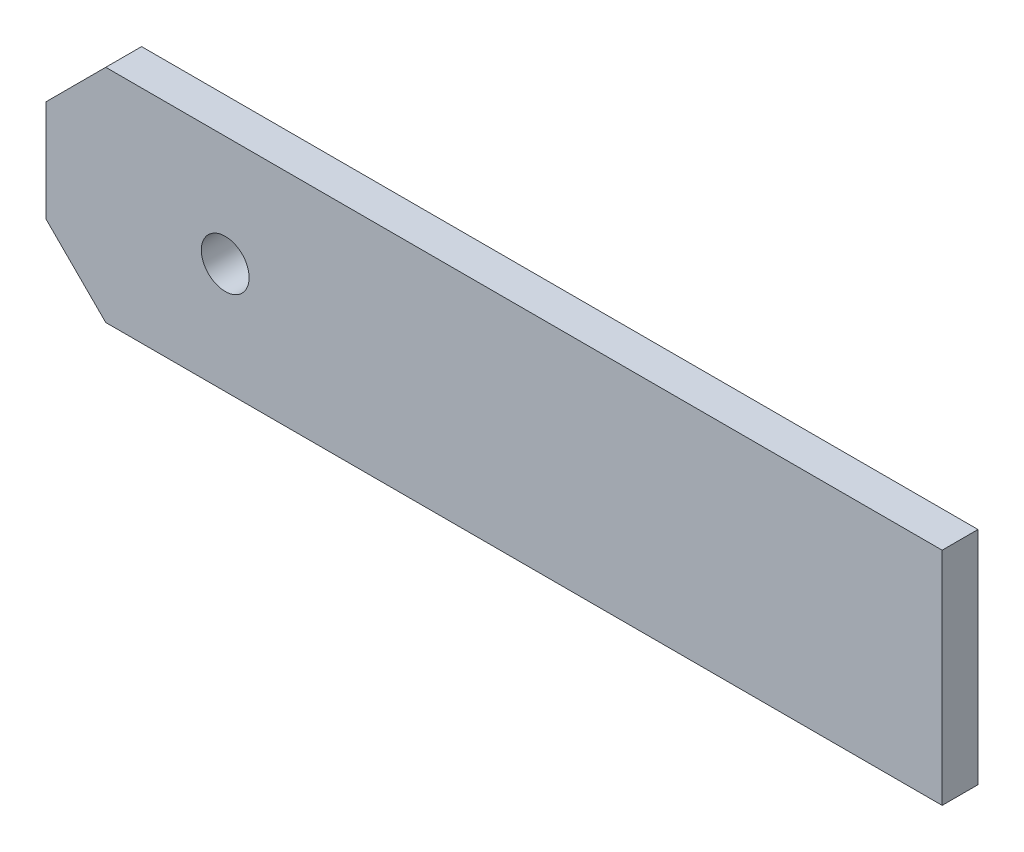
ISO-10303-21;
HEADER;
FILE_DESCRIPTION(('STEP AP214'),'2;1');
FILE_NAME('part.step','',(''),(''),'','','');
FILE_SCHEMA(('AUTOMOTIVE_DESIGN { 1 0 10303 214 1 1 1 1 }'));
ENDSEC;
DATA;
#1=APPLICATION_CONTEXT('core data for automotive mechanical design processes');
#2=APPLICATION_PROTOCOL_DEFINITION('international standard','automotive_design',2000,#1);
#3=PRODUCT_CONTEXT('',#1,'mechanical');
#4=PRODUCT('Part','Part','',(#3));
#5=PRODUCT_RELATED_PRODUCT_CATEGORY('part','',(#4));
#6=PRODUCT_DEFINITION_FORMATION('','',#4);
#7=PRODUCT_DEFINITION_CONTEXT('part definition',#1,'design');
#8=PRODUCT_DEFINITION('design','',#6,#7);
#9=PRODUCT_DEFINITION_SHAPE('','',#8);
#10=(LENGTH_UNIT() NAMED_UNIT(*) SI_UNIT(.MILLI.,.METRE.));
#11=(NAMED_UNIT(*) PLANE_ANGLE_UNIT() SI_UNIT($,.RADIAN.));
#12=(NAMED_UNIT(*) SI_UNIT($,.STERADIAN.) SOLID_ANGLE_UNIT());
#13=UNCERTAINTY_MEASURE_WITH_UNIT(LENGTH_MEASURE(1.E-05),#10,'distance_accuracy_value','');
#14=(GEOMETRIC_REPRESENTATION_CONTEXT(3) GLOBAL_UNCERTAINTY_ASSIGNED_CONTEXT((#13)) GLOBAL_UNIT_ASSIGNED_CONTEXT((#10,
#11,#12)) REPRESENTATION_CONTEXT('',''));
#15=CARTESIAN_POINT('',(0.,0.,0.));
#16=DIRECTION('',(0.,0.,1.));
#17=DIRECTION('',(1.,0.,0.));
#18=AXIS2_PLACEMENT_3D('',#15,#16,#17);
#19=CARTESIAN_POINT('',(0.,0.,6.));
#20=DIRECTION('',(0.,0.,-1.));
#21=DIRECTION('',(-1.,0.,0.));
#22=AXIS2_PLACEMENT_3D('',#19,#20,#21);
#23=PLANE('',#22);
#24=DIRECTION('',(-0.707106781186548,-0.707106781186547,0.));
#25=VECTOR('',#24,1.);
#26=CARTESIAN_POINT('',(-1007.41573033708,56.1348314606742,6.));
#27=LINE('',#26,#25);
#28=CARTESIAN_POINT('',(-997.415730337079,66.1348314606741,6.));
#29=VERTEX_POINT('',#28);
#30=CARTESIAN_POINT('',(-1007.41573033708,56.1348314606742,6.));
#31=VERTEX_POINT('',#30);
#32=EDGE_CURVE('E133',#29,#31,#27,.T.);
#33=ORIENTED_EDGE('',*,*,#32,.T.);
#34=DIRECTION('',(0.,-1.,0.));
#35=VECTOR('',#34,1.);
#36=CARTESIAN_POINT('',(-1007.41573033708,56.1348314606742,6.));
#37=LINE('',#36,#35);
#38=CARTESIAN_POINT('',(-1007.41573033708,39.1348314606742,6.));
#39=VERTEX_POINT('',#38);
#40=EDGE_CURVE('E91',#31,#39,#37,.T.);
#41=ORIENTED_EDGE('',*,*,#40,.T.);
#42=DIRECTION('',(0.707106781186548,-0.707106781186547,0.));
#43=VECTOR('',#42,1.);
#44=CARTESIAN_POINT('',(-1007.41573033708,39.1348314606742,6.));
#45=LINE('',#44,#43);
#46=CARTESIAN_POINT('',(-997.415730337079,29.1348314606742,6.));
#47=VERTEX_POINT('',#46);
#48=EDGE_CURVE('E104',#39,#47,#45,.T.);
#49=ORIENTED_EDGE('',*,*,#48,.T.);
#50=DIRECTION('',(1.,0.,0.));
#51=VECTOR('',#50,1.);
#52=CARTESIAN_POINT('',(-997.415730337079,29.1348314606742,6.));
#53=LINE('',#52,#51);
#54=CARTESIAN_POINT('',(-857.415730337079,29.1348314606742,6.));
#55=VERTEX_POINT('',#54);
#56=EDGE_CURVE('E98',#47,#55,#53,.T.);
#57=ORIENTED_EDGE('',*,*,#56,.T.);
#58=DIRECTION('',(0.,1.,0.));
#59=VECTOR('',#58,1.);
#60=CARTESIAN_POINT('',(-857.415730337079,66.1348314606741,6.));
#61=LINE('',#60,#59);
#62=CARTESIAN_POINT('',(-857.415730337079,66.1348314606741,6.));
#63=VERTEX_POINT('',#62);
#64=EDGE_CURVE('E102',#55,#63,#61,.T.);
#65=ORIENTED_EDGE('',*,*,#64,.T.);
#66=DIRECTION('',(-1.,0.,0.));
#67=VECTOR('',#66,1.);
#68=CARTESIAN_POINT('',(-997.415730337079,66.1348314606741,6.));
#69=LINE('',#68,#67);
#70=EDGE_CURVE('E54',#63,#29,#69,.T.);
#71=ORIENTED_EDGE('',*,*,#70,.T.);
#72=EDGE_LOOP('',(#33,#41,#49,#57,#65,#71));
#73=FACE_BOUND('',#72,.T.);
#74=CARTESIAN_POINT('',(-977.415730337079,47.6348314606742,6.));
#75=DIRECTION('',(0.,0.,1.));
#76=DIRECTION('',(1.,0.,0.));
#77=AXIS2_PLACEMENT_3D('',#74,#75,#76);
#78=CIRCLE('',#77,3.99999999999999);
#79=CARTESIAN_POINT('',(-973.415730337079,47.6348314606742,6.));
#80=VERTEX_POINT('',#79);
#81=EDGE_CURVE('E126',#80,#80,#78,.T.);
#82=ORIENTED_EDGE('',*,*,#81,.F.);
#83=EDGE_LOOP('',(#82));
#84=FACE_BOUND('',#83,.T.);
#85=ADVANCED_FACE('F37',(#73,#84),#23,.F.);
#86=CARTESIAN_POINT('',(0.,0.,0.));
#87=DIRECTION('',(0.,0.,-1.));
#88=DIRECTION('',(-1.,0.,0.));
#89=AXIS2_PLACEMENT_3D('',#86,#87,#88);
#90=PLANE('',#89);
#91=DIRECTION('',(-0.707106781186548,-0.707106781186547,0.));
#92=VECTOR('',#91,1.);
#93=CARTESIAN_POINT('',(-1007.41573033708,56.1348314606742,0.));
#94=LINE('',#93,#92);
#95=CARTESIAN_POINT('',(-997.415730337079,66.1348314606741,0.));
#96=VERTEX_POINT('',#95);
#97=CARTESIAN_POINT('',(-1007.41573033708,56.1348314606742,0.));
#98=VERTEX_POINT('',#97);
#99=EDGE_CURVE('E122',#96,#98,#94,.T.);
#100=ORIENTED_EDGE('',*,*,#99,.F.);
#101=DIRECTION('',(-1.,0.,0.));
#102=VECTOR('',#101,1.);
#103=CARTESIAN_POINT('',(-997.415730337079,66.1348314606741,0.));
#104=LINE('',#103,#102);
#105=CARTESIAN_POINT('',(-857.415730337079,66.1348314606741,0.));
#106=VERTEX_POINT('',#105);
#107=EDGE_CURVE('E83',#106,#96,#104,.T.);
#108=ORIENTED_EDGE('',*,*,#107,.F.);
#109=DIRECTION('',(0.,1.,0.));
#110=VECTOR('',#109,1.);
#111=CARTESIAN_POINT('',(-857.415730337079,66.1348314606741,0.));
#112=LINE('',#111,#110);
#113=CARTESIAN_POINT('',(-857.415730337079,29.1348314606742,0.));
#114=VERTEX_POINT('',#113);
#115=EDGE_CURVE('E77',#114,#106,#112,.T.);
#116=ORIENTED_EDGE('',*,*,#115,.F.);
#117=DIRECTION('',(1.,0.,0.));
#118=VECTOR('',#117,1.);
#119=CARTESIAN_POINT('',(-997.415730337079,29.1348314606742,0.));
#120=LINE('',#119,#118);
#121=CARTESIAN_POINT('',(-997.415730337079,29.1348314606742,0.));
#122=VERTEX_POINT('',#121);
#123=EDGE_CURVE('E112',#122,#114,#120,.T.);
#124=ORIENTED_EDGE('',*,*,#123,.F.);
#125=DIRECTION('',(0.707106781186548,-0.707106781186547,0.));
#126=VECTOR('',#125,1.);
#127=CARTESIAN_POINT('',(-1007.41573033708,39.1348314606742,0.));
#128=LINE('',#127,#126);
#129=CARTESIAN_POINT('',(-1007.41573033708,39.1348314606742,0.));
#130=VERTEX_POINT('',#129);
#131=EDGE_CURVE('E128',#130,#122,#128,.T.);
#132=ORIENTED_EDGE('',*,*,#131,.F.);
#133=DIRECTION('',(0.,-1.,0.));
#134=VECTOR('',#133,1.);
#135=CARTESIAN_POINT('',(-1007.41573033708,56.1348314606742,0.));
#136=LINE('',#135,#134);
#137=EDGE_CURVE('E125',#98,#130,#136,.T.);
#138=ORIENTED_EDGE('',*,*,#137,.F.);
#139=EDGE_LOOP('',(#100,#108,#116,#124,#132,#138));
#140=FACE_BOUND('',#139,.T.);
#141=CARTESIAN_POINT('',(-977.415730337079,47.6348314606742,0.));
#142=DIRECTION('',(0.,0.,1.));
#143=DIRECTION('',(1.,0.,0.));
#144=AXIS2_PLACEMENT_3D('',#141,#142,#143);
#145=CIRCLE('',#144,3.99999999999999);
#146=CARTESIAN_POINT('',(-973.415730337079,47.6348314606742,0.));
#147=VERTEX_POINT('',#146);
#148=EDGE_CURVE('E226',#147,#147,#145,.T.);
#149=ORIENTED_EDGE('',*,*,#148,.T.);
#150=EDGE_LOOP('',(#149));
#151=FACE_BOUND('',#150,.T.);
#152=ADVANCED_FACE('F142',(#140,#151),#90,.T.);
#153=CARTESIAN_POINT('',(-1007.41573033708,56.1348314606742,6.));
#154=DIRECTION('',(0.707106781186547,-0.707106781186548,0.));
#155=DIRECTION('',(0.707106781186548,0.707106781186547,0.));
#156=AXIS2_PLACEMENT_3D('',#153,#154,#155);
#157=PLANE('',#156);
#158=ORIENTED_EDGE('',*,*,#99,.T.);
#159=DIRECTION('',(0.,0.,-1.));
#160=VECTOR('',#159,1.);
#161=CARTESIAN_POINT('',(-1007.41573033708,56.1348314606742,6.));
#162=LINE('',#161,#160);
#163=EDGE_CURVE('E11',#31,#98,#162,.T.);
#164=ORIENTED_EDGE('',*,*,#163,.F.);
#165=ORIENTED_EDGE('',*,*,#32,.F.);
#166=DIRECTION('',(0.,0.,-1.));
#167=VECTOR('',#166,1.);
#168=CARTESIAN_POINT('',(-997.415730337079,66.1348314606741,6.));
#169=LINE('',#168,#167);
#170=EDGE_CURVE('E118',#29,#96,#169,.T.);
#171=ORIENTED_EDGE('',*,*,#170,.T.);
#172=EDGE_LOOP('',(#158,#164,#165,#171));
#173=FACE_BOUND('',#172,.T.);
#174=ADVANCED_FACE('F39',(#173),#157,.F.);
#175=CARTESIAN_POINT('',(-1007.41573033708,56.1348314606742,6.));
#176=DIRECTION('',(1.,0.,0.));
#177=DIRECTION('',(0.,0.,-1.));
#178=AXIS2_PLACEMENT_3D('',#175,#176,#177);
#179=PLANE('',#178);
#180=ORIENTED_EDGE('',*,*,#137,.T.);
#181=DIRECTION('',(0.,0.,-1.));
#182=VECTOR('',#181,1.);
#183=CARTESIAN_POINT('',(-1007.41573033708,39.1348314606742,6.));
#184=LINE('',#183,#182);
#185=EDGE_CURVE('E46',#39,#130,#184,.T.);
#186=ORIENTED_EDGE('',*,*,#185,.F.);
#187=ORIENTED_EDGE('',*,*,#40,.F.);
#188=ORIENTED_EDGE('',*,*,#163,.T.);
#189=EDGE_LOOP('',(#180,#186,#187,#188));
#190=FACE_BOUND('',#189,.T.);
#191=ADVANCED_FACE('F167',(#190),#179,.F.);
#192=CARTESIAN_POINT('',(-1007.41573033708,39.1348314606742,6.));
#193=DIRECTION('',(0.707106781186547,0.707106781186548,0.));
#194=DIRECTION('',(-0.707106781186548,0.707106781186547,0.));
#195=AXIS2_PLACEMENT_3D('',#192,#193,#194);
#196=PLANE('',#195);
#197=ORIENTED_EDGE('',*,*,#131,.T.);
#198=DIRECTION('',(0.,0.,-1.));
#199=VECTOR('',#198,1.);
#200=CARTESIAN_POINT('',(-997.415730337079,29.1348314606742,6.));
#201=LINE('',#200,#199);
#202=EDGE_CURVE('E113',#47,#122,#201,.T.);
#203=ORIENTED_EDGE('',*,*,#202,.F.);
#204=ORIENTED_EDGE('',*,*,#48,.F.);
#205=ORIENTED_EDGE('',*,*,#185,.T.);
#206=EDGE_LOOP('',(#197,#203,#204,#205));
#207=FACE_BOUND('',#206,.T.);
#208=ADVANCED_FACE('F139',(#207),#196,.F.);
#209=CARTESIAN_POINT('',(-997.415730337079,29.1348314606742,6.));
#210=DIRECTION('',(0.,1.,0.));
#211=DIRECTION('',(0.,0.,1.));
#212=AXIS2_PLACEMENT_3D('',#209,#210,#211);
#213=PLANE('',#212);
#214=ORIENTED_EDGE('',*,*,#123,.T.);
#215=DIRECTION('',(0.,0.,-1.));
#216=VECTOR('',#215,1.);
#217=CARTESIAN_POINT('',(-857.415730337079,29.1348314606742,6.));
#218=LINE('',#217,#216);
#219=EDGE_CURVE('E109',#55,#114,#218,.T.);
#220=ORIENTED_EDGE('',*,*,#219,.F.);
#221=ORIENTED_EDGE('',*,*,#56,.F.);
#222=ORIENTED_EDGE('',*,*,#202,.T.);
#223=EDGE_LOOP('',(#214,#220,#221,#222));
#224=FACE_BOUND('',#223,.T.);
#225=ADVANCED_FACE('F110',(#224),#213,.F.);
#226=CARTESIAN_POINT('',(-857.415730337079,66.1348314606741,6.));
#227=DIRECTION('',(-1.,0.,0.));
#228=DIRECTION('',(0.,0.,1.));
#229=AXIS2_PLACEMENT_3D('',#226,#227,#228);
#230=PLANE('',#229);
#231=ORIENTED_EDGE('',*,*,#115,.T.);
#232=DIRECTION('',(0.,0.,-1.));
#233=VECTOR('',#232,1.);
#234=CARTESIAN_POINT('',(-857.415730337079,66.1348314606741,6.));
#235=LINE('',#234,#233);
#236=EDGE_CURVE('E114',#63,#106,#235,.T.);
#237=ORIENTED_EDGE('',*,*,#236,.F.);
#238=ORIENTED_EDGE('',*,*,#64,.F.);
#239=ORIENTED_EDGE('',*,*,#219,.T.);
#240=EDGE_LOOP('',(#231,#237,#238,#239));
#241=FACE_BOUND('',#240,.T.);
#242=ADVANCED_FACE('F116',(#241),#230,.F.);
#243=CARTESIAN_POINT('',(-997.415730337079,66.1348314606741,6.));
#244=DIRECTION('',(0.,-1.,0.));
#245=DIRECTION('',(0.,0.,-1.));
#246=AXIS2_PLACEMENT_3D('',#243,#244,#245);
#247=PLANE('',#246);
#248=ORIENTED_EDGE('',*,*,#107,.T.);
#249=ORIENTED_EDGE('',*,*,#170,.F.);
#250=ORIENTED_EDGE('',*,*,#70,.F.);
#251=ORIENTED_EDGE('',*,*,#236,.T.);
#252=EDGE_LOOP('',(#248,#249,#250,#251));
#253=FACE_BOUND('',#252,.T.);
#254=ADVANCED_FACE('F147',(#253),#247,.F.);
#255=CARTESIAN_POINT('',(-977.415730337079,47.6348314606742,6.));
#256=DIRECTION('',(0.,0.,-1.));
#257=DIRECTION('',(-1.,0.,0.));
#258=AXIS2_PLACEMENT_3D('',#255,#256,#257);
#259=CYLINDRICAL_SURFACE('',#258,3.99999999999999);
#260=ORIENTED_EDGE('',*,*,#81,.T.);
#261=EDGE_LOOP('',(#260));
#262=FACE_BOUND('',#261,.T.);
#263=ORIENTED_EDGE('',*,*,#148,.F.);
#264=EDGE_LOOP('',(#263));
#265=FACE_BOUND('',#264,.T.);
#266=ADVANCED_FACE('F149',(#262,#265),#259,.F.);
#267=CLOSED_SHELL('',(#85,#152,#174,#191,#208,#225,#242,#254,#266));
#268=MANIFOLD_SOLID_BREP('B2',#267);
#269=ADVANCED_BREP_SHAPE_REPRESENTATION('',(#18,#268),#14);
#270=SHAPE_DEFINITION_REPRESENTATION(#9,#269);
ENDSEC;
END-ISO-10303-21;
